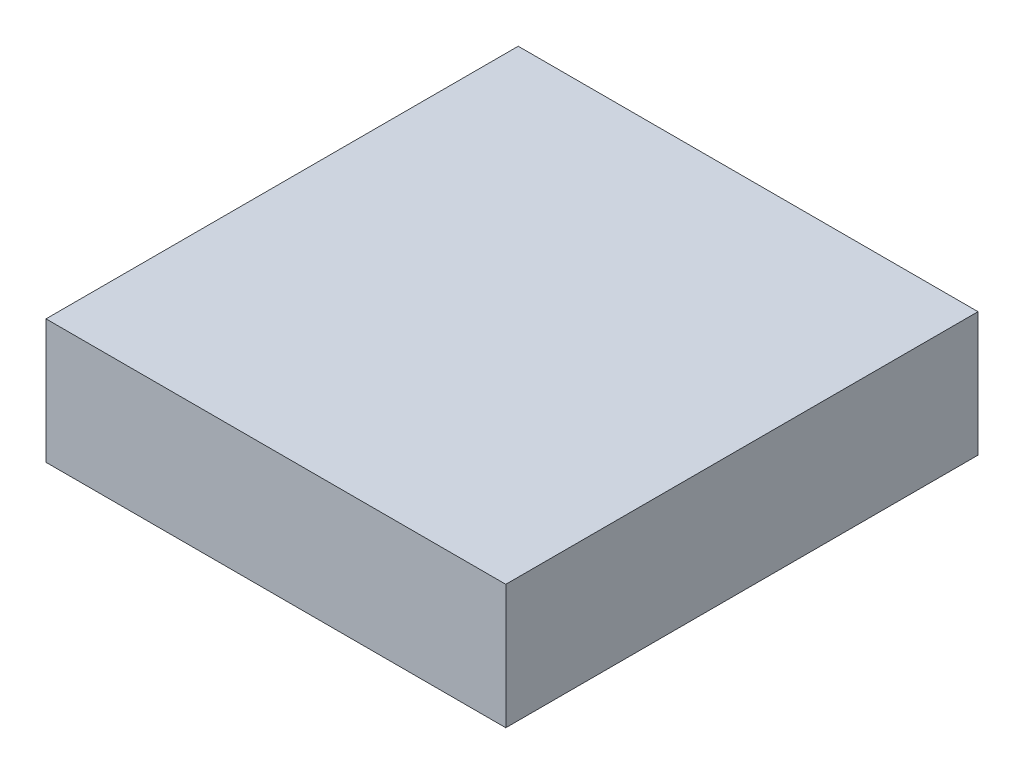
ISO-10303-21;
HEADER;
FILE_DESCRIPTION(('STEP AP214'),'2;1');
FILE_NAME('part.step','',(''),(''),'','','');
FILE_SCHEMA(('AUTOMOTIVE_DESIGN { 1 0 10303 214 1 1 1 1 }'));
ENDSEC;
DATA;
#1=APPLICATION_CONTEXT('core data for automotive mechanical design processes');
#2=APPLICATION_PROTOCOL_DEFINITION('international standard','automotive_design',2000,#1);
#3=PRODUCT_CONTEXT('',#1,'mechanical');
#4=PRODUCT('Part','Part','',(#3));
#5=PRODUCT_RELATED_PRODUCT_CATEGORY('part','',(#4));
#6=PRODUCT_DEFINITION_FORMATION('','',#4);
#7=PRODUCT_DEFINITION_CONTEXT('part definition',#1,'design');
#8=PRODUCT_DEFINITION('design','',#6,#7);
#9=PRODUCT_DEFINITION_SHAPE('','',#8);
#10=(LENGTH_UNIT() NAMED_UNIT(*) SI_UNIT(.MILLI.,.METRE.));
#11=(NAMED_UNIT(*) PLANE_ANGLE_UNIT() SI_UNIT($,.RADIAN.));
#12=(NAMED_UNIT(*) SI_UNIT($,.STERADIAN.) SOLID_ANGLE_UNIT());
#13=UNCERTAINTY_MEASURE_WITH_UNIT(LENGTH_MEASURE(1.E-05),#10,'distance_accuracy_value','');
#14=(GEOMETRIC_REPRESENTATION_CONTEXT(3) GLOBAL_UNCERTAINTY_ASSIGNED_CONTEXT((#13)) GLOBAL_UNIT_ASSIGNED_CONTEXT((#10,
#11,#12)) REPRESENTATION_CONTEXT('',''));
#15=CARTESIAN_POINT('',(0.,0.,0.));
#16=DIRECTION('',(0.,0.,1.));
#17=DIRECTION('',(1.,0.,0.));
#18=AXIS2_PLACEMENT_3D('',#15,#16,#17);
#19=CARTESIAN_POINT('',(18.5,10.,-19.));
#20=DIRECTION('',(-1.,0.,0.));
#21=DIRECTION('',(0.,0.,1.));
#22=AXIS2_PLACEMENT_3D('',#19,#20,#21);
#23=PLANE('',#22);
#24=DIRECTION('',(0.,0.,-1.));
#25=VECTOR('',#24,1.);
#26=CARTESIAN_POINT('',(18.5,0.,-19.));
#27=LINE('',#26,#25);
#28=CARTESIAN_POINT('',(18.5,0.,19.));
#29=VERTEX_POINT('',#28);
#30=CARTESIAN_POINT('',(18.5,0.,-19.));
#31=VERTEX_POINT('',#30);
#32=EDGE_CURVE('E98',#29,#31,#27,.T.);
#33=ORIENTED_EDGE('',*,*,#32,.T.);
#34=DIRECTION('',(0.,-1.,0.));
#35=VECTOR('',#34,1.);
#36=CARTESIAN_POINT('',(18.5,10.,-19.));
#37=LINE('',#36,#35);
#38=CARTESIAN_POINT('',(18.5,10.,-19.));
#39=VERTEX_POINT('',#38);
#40=EDGE_CURVE('E11',#39,#31,#37,.T.);
#41=ORIENTED_EDGE('',*,*,#40,.F.);
#42=DIRECTION('',(0.,0.,-1.));
#43=VECTOR('',#42,1.);
#44=CARTESIAN_POINT('',(18.5,10.,-19.));
#45=LINE('',#44,#43);
#46=CARTESIAN_POINT('',(18.5,10.,19.));
#47=VERTEX_POINT('',#46);
#48=EDGE_CURVE('E85',#47,#39,#45,.T.);
#49=ORIENTED_EDGE('',*,*,#48,.F.);
#50=DIRECTION('',(0.,-1.,0.));
#51=VECTOR('',#50,1.);
#52=CARTESIAN_POINT('',(18.5,10.,19.));
#53=LINE('',#52,#51);
#54=EDGE_CURVE('E94',#47,#29,#53,.T.);
#55=ORIENTED_EDGE('',*,*,#54,.T.);
#56=EDGE_LOOP('',(#33,#41,#49,#55));
#57=FACE_BOUND('',#56,.T.);
#58=ADVANCED_FACE('F35',(#57),#23,.F.);
#59=CARTESIAN_POINT('',(-18.5,10.,-19.));
#60=DIRECTION('',(0.,0.,1.));
#61=DIRECTION('',(1.,0.,0.));
#62=AXIS2_PLACEMENT_3D('',#59,#60,#61);
#63=PLANE('',#62);
#64=DIRECTION('',(-1.,0.,0.));
#65=VECTOR('',#64,1.);
#66=CARTESIAN_POINT('',(-18.5,0.,-19.));
#67=LINE('',#66,#65);
#68=CARTESIAN_POINT('',(-18.5,0.,-19.));
#69=VERTEX_POINT('',#68);
#70=EDGE_CURVE('E90',#31,#69,#67,.T.);
#71=ORIENTED_EDGE('',*,*,#70,.T.);
#72=DIRECTION('',(0.,-1.,0.));
#73=VECTOR('',#72,1.);
#74=CARTESIAN_POINT('',(-18.5,10.,-19.));
#75=LINE('',#74,#73);
#76=CARTESIAN_POINT('',(-18.5,10.,-19.));
#77=VERTEX_POINT('',#76);
#78=EDGE_CURVE('E43',#77,#69,#75,.T.);
#79=ORIENTED_EDGE('',*,*,#78,.F.);
#80=DIRECTION('',(-1.,0.,0.));
#81=VECTOR('',#80,1.);
#82=CARTESIAN_POINT('',(-18.5,10.,-19.));
#83=LINE('',#82,#81);
#84=EDGE_CURVE('E80',#39,#77,#83,.T.);
#85=ORIENTED_EDGE('',*,*,#84,.F.);
#86=ORIENTED_EDGE('',*,*,#40,.T.);
#87=EDGE_LOOP('',(#71,#79,#85,#86));
#88=FACE_BOUND('',#87,.T.);
#89=ADVANCED_FACE('F89',(#88),#63,.F.);
#90=CARTESIAN_POINT('',(-18.5,10.,3.));
#91=DIRECTION('',(1.,0.,0.));
#92=DIRECTION('',(0.,0.,-1.));
#93=AXIS2_PLACEMENT_3D('',#90,#91,#92);
#94=PLANE('',#93);
#95=DIRECTION('',(0.,0.,1.));
#96=VECTOR('',#95,1.);
#97=CARTESIAN_POINT('',(-18.5,0.,3.));
#98=LINE('',#97,#96);
#99=CARTESIAN_POINT('',(-18.5,0.,19.));
#100=VERTEX_POINT('',#99);
#101=EDGE_CURVE('E67',#69,#100,#98,.T.);
#102=ORIENTED_EDGE('',*,*,#101,.T.);
#103=DIRECTION('',(0.,-1.,0.));
#104=VECTOR('',#103,1.);
#105=CARTESIAN_POINT('',(-18.5,10.,19.));
#106=LINE('',#105,#104);
#107=CARTESIAN_POINT('',(-18.5,10.,19.));
#108=VERTEX_POINT('',#107);
#109=EDGE_CURVE('E91',#108,#100,#106,.T.);
#110=ORIENTED_EDGE('',*,*,#109,.F.);
#111=DIRECTION('',(0.,0.,1.));
#112=VECTOR('',#111,1.);
#113=CARTESIAN_POINT('',(-18.5,10.,-19.));
#114=LINE('',#113,#112);
#115=EDGE_CURVE('E83',#77,#108,#114,.T.);
#116=ORIENTED_EDGE('',*,*,#115,.F.);
#117=ORIENTED_EDGE('',*,*,#78,.T.);
#118=EDGE_LOOP('',(#102,#110,#116,#117));
#119=FACE_BOUND('',#118,.T.);
#120=ADVANCED_FACE('F92',(#119),#94,.F.);
#121=CARTESIAN_POINT('',(-18.5,10.,19.));
#122=DIRECTION('',(0.,0.,-1.));
#123=DIRECTION('',(-1.,0.,0.));
#124=AXIS2_PLACEMENT_3D('',#121,#122,#123);
#125=PLANE('',#124);
#126=DIRECTION('',(1.,0.,0.));
#127=VECTOR('',#126,1.);
#128=CARTESIAN_POINT('',(-18.5,0.,19.));
#129=LINE('',#128,#127);
#130=EDGE_CURVE('E73',#100,#29,#129,.T.);
#131=ORIENTED_EDGE('',*,*,#130,.T.);
#132=ORIENTED_EDGE('',*,*,#54,.F.);
#133=DIRECTION('',(1.,0.,0.));
#134=VECTOR('',#133,1.);
#135=CARTESIAN_POINT('',(-18.5,10.,19.));
#136=LINE('',#135,#134);
#137=EDGE_CURVE('E51',#108,#47,#136,.T.);
#138=ORIENTED_EDGE('',*,*,#137,.F.);
#139=ORIENTED_EDGE('',*,*,#109,.T.);
#140=EDGE_LOOP('',(#131,#132,#138,#139));
#141=FACE_BOUND('',#140,.T.);
#142=ADVANCED_FACE('F105',(#141),#125,.F.);
#143=CARTESIAN_POINT('',(0.,10.,0.));
#144=DIRECTION('',(0.,1.,0.));
#145=DIRECTION('',(0.,0.,1.));
#146=AXIS2_PLACEMENT_3D('',#143,#144,#145);
#147=PLANE('',#146);
#148=ORIENTED_EDGE('',*,*,#48,.T.);
#149=ORIENTED_EDGE('',*,*,#84,.T.);
#150=ORIENTED_EDGE('',*,*,#115,.T.);
#151=ORIENTED_EDGE('',*,*,#137,.T.);
#152=EDGE_LOOP('',(#148,#149,#150,#151));
#153=FACE_BOUND('',#152,.T.);
#154=ADVANCED_FACE('F81',(#153),#147,.T.);
#155=CARTESIAN_POINT('',(0.,0.,0.));
#156=DIRECTION('',(0.,1.,0.));
#157=DIRECTION('',(0.,0.,1.));
#158=AXIS2_PLACEMENT_3D('',#155,#156,#157);
#159=PLANE('',#158);
#160=ORIENTED_EDGE('',*,*,#32,.F.);
#161=ORIENTED_EDGE('',*,*,#130,.F.);
#162=ORIENTED_EDGE('',*,*,#101,.F.);
#163=ORIENTED_EDGE('',*,*,#70,.F.);
#164=EDGE_LOOP('',(#160,#161,#162,#163));
#165=FACE_BOUND('',#164,.T.);
#166=ADVANCED_FACE('F108',(#165),#159,.F.);
#167=CLOSED_SHELL('',(#58,#89,#120,#142,#154,#166));
#168=MANIFOLD_SOLID_BREP('B2',#167);
#169=ADVANCED_BREP_SHAPE_REPRESENTATION('',(#18,#168),#14);
#170=SHAPE_DEFINITION_REPRESENTATION(#9,#169);
ENDSEC;
END-ISO-10303-21;
